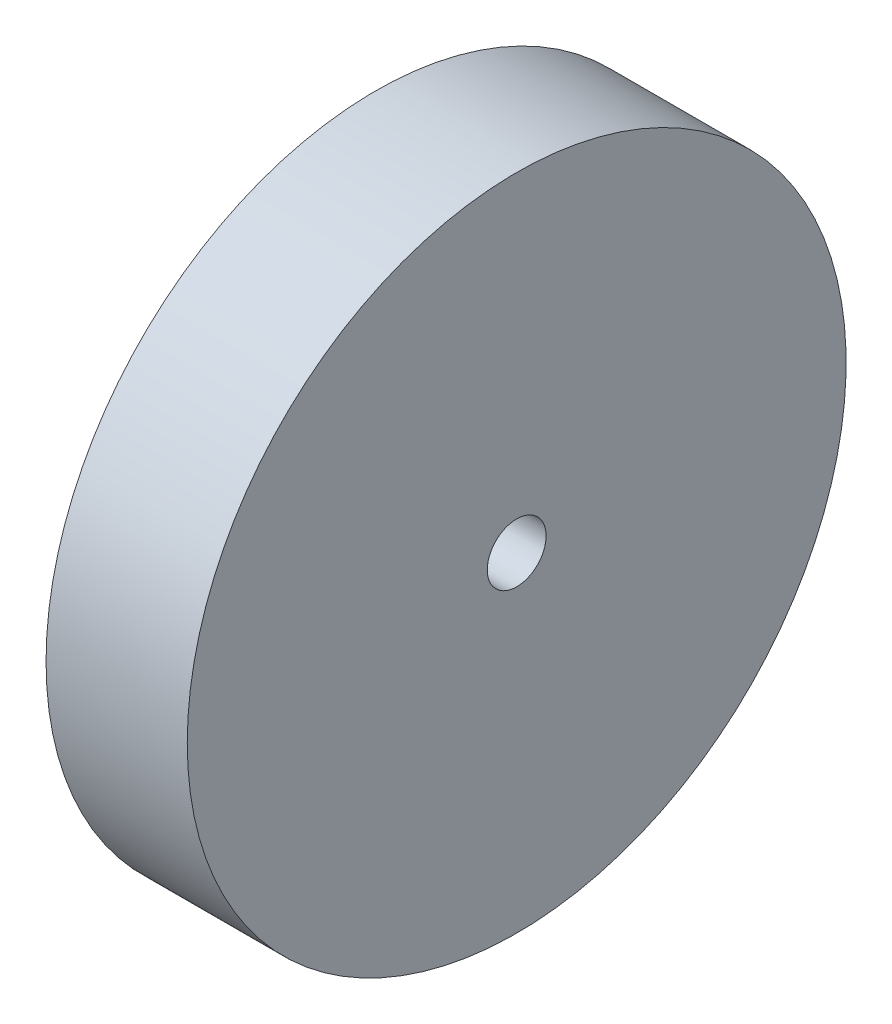
ISO-10303-21;
HEADER;
FILE_DESCRIPTION(('STEP AP214'),'2;1');
FILE_NAME('part.step','',(''),(''),'','','');
FILE_SCHEMA(('AUTOMOTIVE_DESIGN { 1 0 10303 214 1 1 1 1 }'));
ENDSEC;
DATA;
#1=APPLICATION_CONTEXT('core data for automotive mechanical design processes');
#2=APPLICATION_PROTOCOL_DEFINITION('international standard','automotive_design',2000,#1);
#3=PRODUCT_CONTEXT('',#1,'mechanical');
#4=PRODUCT('Part','Part','',(#3));
#5=PRODUCT_RELATED_PRODUCT_CATEGORY('part','',(#4));
#6=PRODUCT_DEFINITION_FORMATION('','',#4);
#7=PRODUCT_DEFINITION_CONTEXT('part definition',#1,'design');
#8=PRODUCT_DEFINITION('design','',#6,#7);
#9=PRODUCT_DEFINITION_SHAPE('','',#8);
#10=(LENGTH_UNIT() NAMED_UNIT(*) SI_UNIT(.MILLI.,.METRE.));
#11=(NAMED_UNIT(*) PLANE_ANGLE_UNIT() SI_UNIT($,.RADIAN.));
#12=(NAMED_UNIT(*) SI_UNIT($,.STERADIAN.) SOLID_ANGLE_UNIT());
#13=UNCERTAINTY_MEASURE_WITH_UNIT(LENGTH_MEASURE(1.E-05),#10,'distance_accuracy_value','');
#14=(GEOMETRIC_REPRESENTATION_CONTEXT(3) GLOBAL_UNCERTAINTY_ASSIGNED_CONTEXT((#13)) GLOBAL_UNIT_ASSIGNED_CONTEXT((#10,
#11,#12)) REPRESENTATION_CONTEXT('',''));
#15=CARTESIAN_POINT('',(0.,0.,0.));
#16=DIRECTION('',(0.,0.,1.));
#17=DIRECTION('',(1.,0.,0.));
#18=AXIS2_PLACEMENT_3D('',#15,#16,#17);
#19=CARTESIAN_POINT('',(-5.99999999999999,0.,0.));
#20=DIRECTION('',(-1.,0.,0.));
#21=DIRECTION('',(0.,0.,1.));
#22=AXIS2_PLACEMENT_3D('',#19,#20,#21);
#23=PLANE('',#22);
#24=CARTESIAN_POINT('',(-5.99999999999999,0.,0.));
#25=DIRECTION('',(-1.,0.,0.));
#26=DIRECTION('',(0.,0.,1.));
#27=AXIS2_PLACEMENT_3D('',#24,#25,#26);
#28=CIRCLE('',#27,2.5);
#29=CARTESIAN_POINT('',(-5.99999999999999,0.,2.5));
#30=VERTEX_POINT('',#29);
#31=EDGE_CURVE('E49',#30,#30,#28,.T.);
#32=ORIENTED_EDGE('',*,*,#31,.F.);
#33=EDGE_LOOP('',(#32));
#34=FACE_BOUND('',#33,.T.);
#35=CARTESIAN_POINT('',(-5.99999999999999,0.,0.));
#36=DIRECTION('',(-1.,0.,0.));
#37=DIRECTION('',(0.,0.,1.));
#38=AXIS2_PLACEMENT_3D('',#35,#36,#37);
#39=CIRCLE('',#38,28.);
#40=CARTESIAN_POINT('',(-5.99999999999999,0.,28.));
#41=VERTEX_POINT('',#40);
#42=EDGE_CURVE('E10',#41,#41,#39,.T.);
#43=ORIENTED_EDGE('',*,*,#42,.T.);
#44=EDGE_LOOP('',(#43));
#45=FACE_BOUND('',#44,.T.);
#46=ADVANCED_FACE('F35',(#34,#45),#23,.T.);
#47=CARTESIAN_POINT('',(-16.7109178913165,0.,0.));
#48=DIRECTION('',(-1.,0.,0.));
#49=DIRECTION('',(0.,0.,1.));
#50=AXIS2_PLACEMENT_3D('',#47,#48,#49);
#51=CYLINDRICAL_SURFACE('',#50,28.);
#52=CARTESIAN_POINT('',(6.00000000000001,0.,0.));
#53=DIRECTION('',(-1.,0.,0.));
#54=DIRECTION('',(0.,0.,1.));
#55=AXIS2_PLACEMENT_3D('',#52,#53,#54);
#56=CIRCLE('',#55,28.);
#57=CARTESIAN_POINT('',(6.00000000000001,0.,28.));
#58=VERTEX_POINT('',#57);
#59=EDGE_CURVE('E41',#58,#58,#56,.T.);
#60=ORIENTED_EDGE('',*,*,#59,.T.);
#61=EDGE_LOOP('',(#60));
#62=FACE_BOUND('',#61,.T.);
#63=ORIENTED_EDGE('',*,*,#42,.F.);
#64=EDGE_LOOP('',(#63));
#65=FACE_BOUND('',#64,.T.);
#66=ADVANCED_FACE('F58',(#62,#65),#51,.T.);
#67=CARTESIAN_POINT('',(6.,0.,0.));
#68=DIRECTION('',(1.,0.,0.));
#69=DIRECTION('',(0.,0.,-1.));
#70=AXIS2_PLACEMENT_3D('',#67,#68,#69);
#71=PLANE('',#70);
#72=CARTESIAN_POINT('',(6.00000000000001,0.,0.));
#73=DIRECTION('',(-1.,0.,0.));
#74=DIRECTION('',(0.,0.,1.));
#75=AXIS2_PLACEMENT_3D('',#72,#73,#74);
#76=CIRCLE('',#75,2.5);
#77=CARTESIAN_POINT('',(6.00000000000001,0.,2.5));
#78=VERTEX_POINT('',#77);
#79=EDGE_CURVE('E45',#78,#78,#76,.T.);
#80=ORIENTED_EDGE('',*,*,#79,.T.);
#81=EDGE_LOOP('',(#80));
#82=FACE_BOUND('',#81,.T.);
#83=ORIENTED_EDGE('',*,*,#59,.F.);
#84=EDGE_LOOP('',(#83));
#85=FACE_BOUND('',#84,.T.);
#86=ADVANCED_FACE('F62',(#82,#85),#71,.T.);
#87=CARTESIAN_POINT('',(6.00000000000001,0.,0.));
#88=DIRECTION('',(-1.,0.,0.));
#89=DIRECTION('',(0.,0.,1.));
#90=AXIS2_PLACEMENT_3D('',#87,#88,#89);
#91=CYLINDRICAL_SURFACE('',#90,2.5);
#92=ORIENTED_EDGE('',*,*,#79,.F.);
#93=EDGE_LOOP('',(#92));
#94=FACE_BOUND('',#93,.T.);
#95=ORIENTED_EDGE('',*,*,#31,.T.);
#96=EDGE_LOOP('',(#95));
#97=FACE_BOUND('',#96,.T.);
#98=ADVANCED_FACE('F55',(#94,#97),#91,.F.);
#99=CLOSED_SHELL('',(#46,#66,#86,#98));
#100=MANIFOLD_SOLID_BREP('B2',#99);
#101=ADVANCED_BREP_SHAPE_REPRESENTATION('',(#18,#100),#14);
#102=SHAPE_DEFINITION_REPRESENTATION(#9,#101);
ENDSEC;
END-ISO-10303-21;
